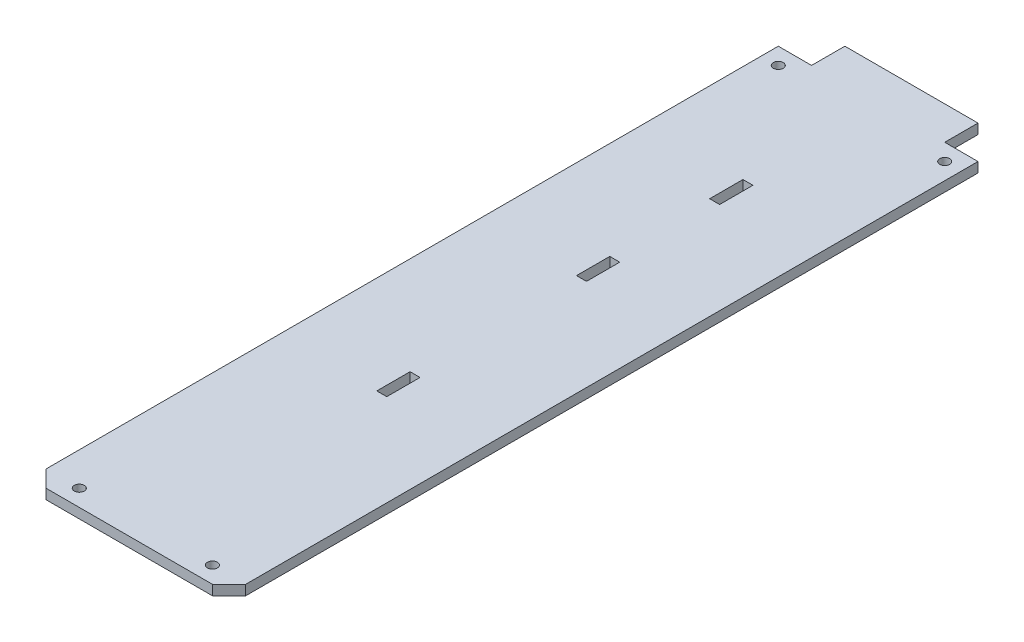
ISO-10303-21;
HEADER;
FILE_DESCRIPTION(('STEP AP214'),'2;1');
FILE_NAME('part.step','',(''),(''),'','','');
FILE_SCHEMA(('AUTOMOTIVE_DESIGN { 1 0 10303 214 1 1 1 1 }'));
ENDSEC;
DATA;
#1=APPLICATION_CONTEXT('core data for automotive mechanical design processes');
#2=APPLICATION_PROTOCOL_DEFINITION('international standard','automotive_design',2000,#1);
#3=PRODUCT_CONTEXT('',#1,'mechanical');
#4=PRODUCT('Part','Part','',(#3));
#5=PRODUCT_RELATED_PRODUCT_CATEGORY('part','',(#4));
#6=PRODUCT_DEFINITION_FORMATION('','',#4);
#7=PRODUCT_DEFINITION_CONTEXT('part definition',#1,'design');
#8=PRODUCT_DEFINITION('design','',#6,#7);
#9=PRODUCT_DEFINITION_SHAPE('','',#8);
#10=(LENGTH_UNIT() NAMED_UNIT(*) SI_UNIT(.MILLI.,.METRE.));
#11=(NAMED_UNIT(*) PLANE_ANGLE_UNIT() SI_UNIT($,.RADIAN.));
#12=(NAMED_UNIT(*) SI_UNIT($,.STERADIAN.) SOLID_ANGLE_UNIT());
#13=UNCERTAINTY_MEASURE_WITH_UNIT(LENGTH_MEASURE(1.E-05),#10,'distance_accuracy_value','');
#14=(GEOMETRIC_REPRESENTATION_CONTEXT(3) GLOBAL_UNCERTAINTY_ASSIGNED_CONTEXT((#13)) GLOBAL_UNIT_ASSIGNED_CONTEXT((#10,
#11,#12)) REPRESENTATION_CONTEXT('',''));
#15=CARTESIAN_POINT('',(0.,0.,0.));
#16=DIRECTION('',(0.,0.,1.));
#17=DIRECTION('',(1.,0.,0.));
#18=AXIS2_PLACEMENT_3D('',#15,#16,#17);
#19=CARTESIAN_POINT('',(29.1206219769056,3.,-112.5));
#20=DIRECTION('',(-1.,0.,0.));
#21=DIRECTION('',(0.,0.,1.));
#22=AXIS2_PLACEMENT_3D('',#19,#20,#21);
#23=PLANE('',#22);
#24=DIRECTION('',(0.,0.,-1.));
#25=VECTOR('',#24,1.);
#26=CARTESIAN_POINT('',(29.1206219769056,3.,-112.5));
#27=LINE('',#26,#25);
#28=CARTESIAN_POINT('',(29.1206219769056,3.,107.5));
#29=VERTEX_POINT('',#28);
#30=CARTESIAN_POINT('',(29.1206219769056,3.,-112.5));
#31=VERTEX_POINT('',#30);
#32=EDGE_CURVE('E271',#29,#31,#27,.T.);
#33=ORIENTED_EDGE('',*,*,#32,.F.);
#34=DIRECTION('',(0.,-1.,0.));
#35=VECTOR('',#34,1.);
#36=CARTESIAN_POINT('',(29.1206219769056,3.,107.5));
#37=LINE('',#36,#35);
#38=CARTESIAN_POINT('',(29.1206219769056,0.,107.5));
#39=VERTEX_POINT('',#38);
#40=EDGE_CURVE('E11',#29,#39,#37,.T.);
#41=ORIENTED_EDGE('',*,*,#40,.T.);
#42=DIRECTION('',(0.,0.,-1.));
#43=VECTOR('',#42,1.);
#44=CARTESIAN_POINT('',(29.1206219769056,0.,-112.5));
#45=LINE('',#44,#43);
#46=CARTESIAN_POINT('',(29.1206219769056,0.,-112.5));
#47=VERTEX_POINT('',#46);
#48=EDGE_CURVE('E289',#39,#47,#45,.T.);
#49=ORIENTED_EDGE('',*,*,#48,.T.);
#50=DIRECTION('',(0.,-1.,0.));
#51=VECTOR('',#50,1.);
#52=CARTESIAN_POINT('',(29.1206219769056,3.,-112.5));
#53=LINE('',#52,#51);
#54=EDGE_CURVE('E320',#31,#47,#53,.T.);
#55=ORIENTED_EDGE('',*,*,#54,.F.);
#56=EDGE_LOOP('',(#33,#41,#49,#55));
#57=FACE_BOUND('',#56,.T.);
#58=ADVANCED_FACE('F34',(#57),#23,.F.);
#59=CARTESIAN_POINT('',(19.1206219769056,3.,-112.5));
#60=DIRECTION('',(0.,0.,1.));
#61=DIRECTION('',(1.,0.,0.));
#62=AXIS2_PLACEMENT_3D('',#59,#60,#61);
#63=PLANE('',#62);
#64=DIRECTION('',(-1.,0.,0.));
#65=VECTOR('',#64,1.);
#66=CARTESIAN_POINT('',(19.1206219769056,0.,-112.5));
#67=LINE('',#66,#65);
#68=CARTESIAN_POINT('',(19.1206219769056,0.,-112.5));
#69=VERTEX_POINT('',#68);
#70=EDGE_CURVE('E291',#47,#69,#67,.T.);
#71=ORIENTED_EDGE('',*,*,#70,.T.);
#72=DIRECTION('',(0.,-1.,0.));
#73=VECTOR('',#72,1.);
#74=CARTESIAN_POINT('',(19.1206219769056,3.,-112.5));
#75=LINE('',#74,#73);
#76=CARTESIAN_POINT('',(19.1206219769056,3.,-112.5));
#77=VERTEX_POINT('',#76);
#78=EDGE_CURVE('E317',#77,#69,#75,.T.);
#79=ORIENTED_EDGE('',*,*,#78,.F.);
#80=DIRECTION('',(-1.,0.,0.));
#81=VECTOR('',#80,1.);
#82=CARTESIAN_POINT('',(19.1206219769056,3.,-112.5));
#83=LINE('',#82,#81);
#84=EDGE_CURVE('E273',#31,#77,#83,.T.);
#85=ORIENTED_EDGE('',*,*,#84,.F.);
#86=ORIENTED_EDGE('',*,*,#54,.T.);
#87=EDGE_LOOP('',(#71,#79,#85,#86));
#88=FACE_BOUND('',#87,.T.);
#89=ADVANCED_FACE('F416',(#88),#63,.F.);
#90=CARTESIAN_POINT('',(19.1206219769056,3.,-112.5));
#91=DIRECTION('',(-1.,0.,0.));
#92=DIRECTION('',(0.,0.,1.));
#93=AXIS2_PLACEMENT_3D('',#90,#91,#92);
#94=PLANE('',#93);
#95=DIRECTION('',(0.,0.,-1.));
#96=VECTOR('',#95,1.);
#97=CARTESIAN_POINT('',(19.1206219769056,0.,-112.5));
#98=LINE('',#97,#96);
#99=CARTESIAN_POINT('',(19.1206219769056,0.,-122.5));
#100=VERTEX_POINT('',#99);
#101=EDGE_CURVE('E294',#69,#100,#98,.T.);
#102=ORIENTED_EDGE('',*,*,#101,.T.);
#103=DIRECTION('',(0.,-1.,0.));
#104=VECTOR('',#103,1.);
#105=CARTESIAN_POINT('',(19.1206219769056,3.,-122.5));
#106=LINE('',#105,#104);
#107=CARTESIAN_POINT('',(19.1206219769056,3.,-122.5));
#108=VERTEX_POINT('',#107);
#109=EDGE_CURVE('E314',#108,#100,#106,.T.);
#110=ORIENTED_EDGE('',*,*,#109,.F.);
#111=DIRECTION('',(0.,0.,-1.));
#112=VECTOR('',#111,1.);
#113=CARTESIAN_POINT('',(19.1206219769056,3.,-112.5));
#114=LINE('',#113,#112);
#115=EDGE_CURVE('E276',#77,#108,#114,.T.);
#116=ORIENTED_EDGE('',*,*,#115,.F.);
#117=ORIENTED_EDGE('',*,*,#78,.T.);
#118=EDGE_LOOP('',(#102,#110,#116,#117));
#119=FACE_BOUND('',#118,.T.);
#120=ADVANCED_FACE('F409',(#119),#94,.F.);
#121=CARTESIAN_POINT('',(-20.8793780230944,3.,-122.5));
#122=DIRECTION('',(0.,0.,1.));
#123=DIRECTION('',(1.,0.,0.));
#124=AXIS2_PLACEMENT_3D('',#121,#122,#123);
#125=PLANE('',#124);
#126=DIRECTION('',(-1.,0.,0.));
#127=VECTOR('',#126,1.);
#128=CARTESIAN_POINT('',(-20.8793780230944,0.,-122.5));
#129=LINE('',#128,#127);
#130=CARTESIAN_POINT('',(-20.8793780230944,0.,-122.5));
#131=VERTEX_POINT('',#130);
#132=EDGE_CURVE('E296',#100,#131,#129,.T.);
#133=ORIENTED_EDGE('',*,*,#132,.T.);
#134=DIRECTION('',(0.,-1.,0.));
#135=VECTOR('',#134,1.);
#136=CARTESIAN_POINT('',(-20.8793780230944,3.,-122.5));
#137=LINE('',#136,#135);
#138=CARTESIAN_POINT('',(-20.8793780230944,3.,-122.5));
#139=VERTEX_POINT('',#138);
#140=EDGE_CURVE('E311',#139,#131,#137,.T.);
#141=ORIENTED_EDGE('',*,*,#140,.F.);
#142=DIRECTION('',(-1.,0.,0.));
#143=VECTOR('',#142,1.);
#144=CARTESIAN_POINT('',(-20.8793780230944,3.,-122.5));
#145=LINE('',#144,#143);
#146=EDGE_CURVE('E278',#108,#139,#145,.T.);
#147=ORIENTED_EDGE('',*,*,#146,.F.);
#148=ORIENTED_EDGE('',*,*,#109,.T.);
#149=EDGE_LOOP('',(#133,#141,#147,#148));
#150=FACE_BOUND('',#149,.T.);
#151=ADVANCED_FACE('F405',(#150),#125,.F.);
#152=CARTESIAN_POINT('',(-20.8793780230944,3.,-112.5));
#153=DIRECTION('',(1.,0.,0.));
#154=DIRECTION('',(0.,0.,-1.));
#155=AXIS2_PLACEMENT_3D('',#152,#153,#154);
#156=PLANE('',#155);
#157=DIRECTION('',(0.,0.,1.));
#158=VECTOR('',#157,1.);
#159=CARTESIAN_POINT('',(-20.8793780230944,0.,-112.5));
#160=LINE('',#159,#158);
#161=CARTESIAN_POINT('',(-20.8793780230944,0.,-112.5));
#162=VERTEX_POINT('',#161);
#163=EDGE_CURVE('E298',#131,#162,#160,.T.);
#164=ORIENTED_EDGE('',*,*,#163,.T.);
#165=DIRECTION('',(0.,-1.,0.));
#166=VECTOR('',#165,1.);
#167=CARTESIAN_POINT('',(-20.8793780230944,3.,-112.5));
#168=LINE('',#167,#166);
#169=CARTESIAN_POINT('',(-20.8793780230944,3.,-112.5));
#170=VERTEX_POINT('',#169);
#171=EDGE_CURVE('E308',#170,#162,#168,.T.);
#172=ORIENTED_EDGE('',*,*,#171,.F.);
#173=DIRECTION('',(0.,0.,1.));
#174=VECTOR('',#173,1.);
#175=CARTESIAN_POINT('',(-20.8793780230944,3.,-112.5));
#176=LINE('',#175,#174);
#177=EDGE_CURVE('E280',#139,#170,#176,.T.);
#178=ORIENTED_EDGE('',*,*,#177,.F.);
#179=ORIENTED_EDGE('',*,*,#140,.T.);
#180=EDGE_LOOP('',(#164,#172,#178,#179));
#181=FACE_BOUND('',#180,.T.);
#182=ADVANCED_FACE('F400',(#181),#156,.F.);
#183=CARTESIAN_POINT('',(-30.8793780230944,3.,-112.5));
#184=DIRECTION('',(0.,0.,1.));
#185=DIRECTION('',(1.,0.,0.));
#186=AXIS2_PLACEMENT_3D('',#183,#184,#185);
#187=PLANE('',#186);
#188=DIRECTION('',(-1.,0.,0.));
#189=VECTOR('',#188,1.);
#190=CARTESIAN_POINT('',(-30.8793780230944,0.,-112.5));
#191=LINE('',#190,#189);
#192=CARTESIAN_POINT('',(-30.8793780230944,0.,-112.5));
#193=VERTEX_POINT('',#192);
#194=EDGE_CURVE('E300',#162,#193,#191,.T.);
#195=ORIENTED_EDGE('',*,*,#194,.T.);
#196=DIRECTION('',(0.,-1.,0.));
#197=VECTOR('',#196,1.);
#198=CARTESIAN_POINT('',(-30.8793780230944,3.,-112.5));
#199=LINE('',#198,#197);
#200=CARTESIAN_POINT('',(-30.8793780230944,3.,-112.5));
#201=VERTEX_POINT('',#200);
#202=EDGE_CURVE('E288',#201,#193,#199,.T.);
#203=ORIENTED_EDGE('',*,*,#202,.F.);
#204=DIRECTION('',(-1.,0.,0.));
#205=VECTOR('',#204,1.);
#206=CARTESIAN_POINT('',(-30.8793780230944,3.,-112.5));
#207=LINE('',#206,#205);
#208=EDGE_CURVE('E282',#170,#201,#207,.T.);
#209=ORIENTED_EDGE('',*,*,#208,.F.);
#210=ORIENTED_EDGE('',*,*,#171,.T.);
#211=EDGE_LOOP('',(#195,#203,#209,#210));
#212=FACE_BOUND('',#211,.T.);
#213=ADVANCED_FACE('F394',(#212),#187,.F.);
#214=CARTESIAN_POINT('',(-30.8793780230944,3.,-112.5));
#215=DIRECTION('',(1.,0.,0.));
#216=DIRECTION('',(0.,0.,-1.));
#217=AXIS2_PLACEMENT_3D('',#214,#215,#216);
#218=PLANE('',#217);
#219=DIRECTION('',(0.,0.,1.));
#220=VECTOR('',#219,1.);
#221=CARTESIAN_POINT('',(-30.8793780230944,0.,-112.5));
#222=LINE('',#221,#220);
#223=CARTESIAN_POINT('',(-30.8793780230944,0.,107.5));
#224=VERTEX_POINT('',#223);
#225=EDGE_CURVE('E302',#193,#224,#222,.T.);
#226=ORIENTED_EDGE('',*,*,#225,.T.);
#227=DIRECTION('',(0.,1.,0.));
#228=VECTOR('',#227,1.);
#229=CARTESIAN_POINT('',(-30.8793780230944,3.,107.5));
#230=LINE('',#229,#228);
#231=CARTESIAN_POINT('',(-30.8793780230944,3.,107.5));
#232=VERTEX_POINT('',#231);
#233=EDGE_CURVE('E57',#224,#232,#230,.T.);
#234=ORIENTED_EDGE('',*,*,#233,.T.);
#235=DIRECTION('',(0.,0.,1.));
#236=VECTOR('',#235,1.);
#237=CARTESIAN_POINT('',(-30.8793780230944,3.,-112.5));
#238=LINE('',#237,#236);
#239=EDGE_CURVE('E284',#201,#232,#238,.T.);
#240=ORIENTED_EDGE('',*,*,#239,.F.);
#241=ORIENTED_EDGE('',*,*,#202,.T.);
#242=EDGE_LOOP('',(#226,#234,#240,#241));
#243=FACE_BOUND('',#242,.T.);
#244=ADVANCED_FACE('F390',(#243),#218,.F.);
#245=CARTESIAN_POINT('',(-30.8793780230944,3.,112.5));
#246=DIRECTION('',(0.,0.,-1.));
#247=DIRECTION('',(-1.,0.,0.));
#248=AXIS2_PLACEMENT_3D('',#245,#246,#247);
#249=PLANE('',#248);
#250=DIRECTION('',(1.,0.,0.));
#251=VECTOR('',#250,1.);
#252=CARTESIAN_POINT('',(-30.8793780230944,3.,112.5));
#253=LINE('',#252,#251);
#254=CARTESIAN_POINT('',(-25.8793780230944,3.,112.5));
#255=VERTEX_POINT('',#254);
#256=CARTESIAN_POINT('',(24.1206219769056,3.,112.5));
#257=VERTEX_POINT('',#256);
#258=EDGE_CURVE('E286',#255,#257,#253,.T.);
#259=ORIENTED_EDGE('',*,*,#258,.F.);
#260=DIRECTION('',(0.,-1.,0.));
#261=VECTOR('',#260,1.);
#262=CARTESIAN_POINT('',(-25.8793780230944,3.,112.5));
#263=LINE('',#262,#261);
#264=CARTESIAN_POINT('',(-25.8793780230944,0.,112.5));
#265=VERTEX_POINT('',#264);
#266=EDGE_CURVE('E369',#255,#265,#263,.T.);
#267=ORIENTED_EDGE('',*,*,#266,.T.);
#268=DIRECTION('',(1.,0.,0.));
#269=VECTOR('',#268,1.);
#270=CARTESIAN_POINT('',(-30.8793780230944,0.,112.5));
#271=LINE('',#270,#269);
#272=CARTESIAN_POINT('',(24.1206219769056,0.,112.5));
#273=VERTEX_POINT('',#272);
#274=EDGE_CURVE('E274',#265,#273,#271,.T.);
#275=ORIENTED_EDGE('',*,*,#274,.T.);
#276=DIRECTION('',(0.,1.,0.));
#277=VECTOR('',#276,1.);
#278=CARTESIAN_POINT('',(24.1206219769056,3.,112.5));
#279=LINE('',#278,#277);
#280=EDGE_CURVE('E365',#273,#257,#279,.T.);
#281=ORIENTED_EDGE('',*,*,#280,.T.);
#282=EDGE_LOOP('',(#259,#267,#275,#281));
#283=FACE_BOUND('',#282,.T.);
#284=ADVANCED_FACE('F382',(#283),#249,.F.);
#285=CARTESIAN_POINT('',(0.,3.,0.));
#286=DIRECTION('',(0.,1.,0.));
#287=DIRECTION('',(0.,0.,1.));
#288=AXIS2_PLACEMENT_3D('',#285,#286,#287);
#289=PLANE('',#288);
#290=CARTESIAN_POINT('',(24.1206219769056,3.,-107.5));
#291=DIRECTION('',(0.,1.,0.));
#292=DIRECTION('',(0.,0.,1.));
#293=AXIS2_PLACEMENT_3D('',#290,#291,#292);
#294=CIRCLE('',#293,1.5);
#295=CARTESIAN_POINT('',(24.1206219769056,3.,-106.));
#296=VERTEX_POINT('',#295);
#297=EDGE_CURVE('E268',#296,#296,#294,.T.);
#298=ORIENTED_EDGE('',*,*,#297,.F.);
#299=EDGE_LOOP('',(#298));
#300=FACE_BOUND('',#299,.T.);
#301=DIRECTION('',(0.,0.,-1.));
#302=VECTOR('',#301,1.);
#303=CARTESIAN_POINT('',(1.5,3.,-32.5));
#304=LINE('',#303,#302);
#305=CARTESIAN_POINT('',(1.5,3.,-22.5));
#306=VERTEX_POINT('',#305);
#307=CARTESIAN_POINT('',(1.5,3.,-32.5));
#308=VERTEX_POINT('',#307);
#309=EDGE_CURVE('E222',#306,#308,#304,.T.);
#310=ORIENTED_EDGE('',*,*,#309,.F.);
#311=DIRECTION('',(1.,0.,0.));
#312=VECTOR('',#311,1.);
#313=CARTESIAN_POINT('',(-1.5,3.,-22.5));
#314=LINE('',#313,#312);
#315=CARTESIAN_POINT('',(-1.5,3.,-22.5));
#316=VERTEX_POINT('',#315);
#317=EDGE_CURVE('E230',#316,#306,#314,.T.);
#318=ORIENTED_EDGE('',*,*,#317,.F.);
#319=DIRECTION('',(0.,0.,1.));
#320=VECTOR('',#319,1.);
#321=CARTESIAN_POINT('',(-1.5,3.,-32.5));
#322=LINE('',#321,#320);
#323=CARTESIAN_POINT('',(-1.5,3.,-32.5));
#324=VERTEX_POINT('',#323);
#325=EDGE_CURVE('E227',#324,#316,#322,.T.);
#326=ORIENTED_EDGE('',*,*,#325,.F.);
#327=DIRECTION('',(-1.,0.,0.));
#328=VECTOR('',#327,1.);
#329=CARTESIAN_POINT('',(-1.5,3.,-32.5));
#330=LINE('',#329,#328);
#331=EDGE_CURVE('E224',#308,#324,#330,.T.);
#332=ORIENTED_EDGE('',*,*,#331,.F.);
#333=EDGE_LOOP('',(#310,#318,#326,#332));
#334=FACE_BOUND('',#333,.T.);
#335=DIRECTION('',(0.,0.,-1.));
#336=VECTOR('',#335,1.);
#337=CARTESIAN_POINT('',(1.5,3.,27.5));
#338=LINE('',#337,#336);
#339=CARTESIAN_POINT('',(1.5,3.,37.5));
#340=VERTEX_POINT('',#339);
#341=CARTESIAN_POINT('',(1.5,3.,27.5));
#342=VERTEX_POINT('',#341);
#343=EDGE_CURVE('E207',#340,#342,#338,.T.);
#344=ORIENTED_EDGE('',*,*,#343,.F.);
#345=DIRECTION('',(1.,0.,0.));
#346=VECTOR('',#345,1.);
#347=CARTESIAN_POINT('',(-1.5,3.,37.5));
#348=LINE('',#347,#346);
#349=CARTESIAN_POINT('',(-1.5,3.,37.5));
#350=VERTEX_POINT('',#349);
#351=EDGE_CURVE('E212',#350,#340,#348,.T.);
#352=ORIENTED_EDGE('',*,*,#351,.F.);
#353=DIRECTION('',(0.,0.,1.));
#354=VECTOR('',#353,1.);
#355=CARTESIAN_POINT('',(-1.5,3.,27.5));
#356=LINE('',#355,#354);
#357=CARTESIAN_POINT('',(-1.5,3.,27.5));
#358=VERTEX_POINT('',#357);
#359=EDGE_CURVE('E191',#358,#350,#356,.T.);
#360=ORIENTED_EDGE('',*,*,#359,.F.);
#361=DIRECTION('',(-1.,0.,0.));
#362=VECTOR('',#361,1.);
#363=CARTESIAN_POINT('',(-1.5,3.,27.5));
#364=LINE('',#363,#362);
#365=EDGE_CURVE('E202',#342,#358,#364,.T.);
#366=ORIENTED_EDGE('',*,*,#365,.F.);
#367=EDGE_LOOP('',(#344,#352,#360,#366));
#368=FACE_BOUND('',#367,.T.);
#369=CARTESIAN_POINT('',(-25.8793780230944,3.,-107.5));
#370=DIRECTION('',(0.,1.,0.));
#371=DIRECTION('',(0.,0.,1.));
#372=AXIS2_PLACEMENT_3D('',#369,#370,#371);
#373=CIRCLE('',#372,1.5);
#374=CARTESIAN_POINT('',(-25.8793780230944,3.,-106.));
#375=VERTEX_POINT('',#374);
#376=EDGE_CURVE('E265',#375,#375,#373,.T.);
#377=ORIENTED_EDGE('',*,*,#376,.F.);
#378=EDGE_LOOP('',(#377));
#379=FACE_BOUND('',#378,.T.);
#380=CARTESIAN_POINT('',(19.1206219769056,3.,107.5));
#381=DIRECTION('',(0.,1.,0.));
#382=DIRECTION('',(0.,0.,1.));
#383=AXIS2_PLACEMENT_3D('',#380,#381,#382);
#384=CIRCLE('',#383,1.5);
#385=CARTESIAN_POINT('',(19.1206219769056,3.,109.));
#386=VERTEX_POINT('',#385);
#387=EDGE_CURVE('E245',#386,#386,#384,.T.);
#388=ORIENTED_EDGE('',*,*,#387,.F.);
#389=EDGE_LOOP('',(#388));
#390=FACE_BOUND('',#389,.T.);
#391=CARTESIAN_POINT('',(-20.8793780230944,3.,107.5));
#392=DIRECTION('',(0.,1.,0.));
#393=DIRECTION('',(0.,0.,1.));
#394=AXIS2_PLACEMENT_3D('',#391,#392,#393);
#395=CIRCLE('',#394,1.5);
#396=CARTESIAN_POINT('',(-20.8793780230944,3.,109.));
#397=VERTEX_POINT('',#396);
#398=EDGE_CURVE('E242',#397,#397,#395,.T.);
#399=ORIENTED_EDGE('',*,*,#398,.F.);
#400=EDGE_LOOP('',(#399));
#401=FACE_BOUND('',#400,.T.);
#402=DIRECTION('',(0.,0.,-1.));
#403=VECTOR('',#402,1.);
#404=CARTESIAN_POINT('',(1.5,3.,-72.5));
#405=LINE('',#404,#403);
#406=CARTESIAN_POINT('',(1.5,3.,-62.5));
#407=VERTEX_POINT('',#406);
#408=CARTESIAN_POINT('',(1.5,3.,-72.5));
#409=VERTEX_POINT('',#408);
#410=EDGE_CURVE('E219',#407,#409,#405,.T.);
#411=ORIENTED_EDGE('',*,*,#410,.F.);
#412=DIRECTION('',(1.,0.,0.));
#413=VECTOR('',#412,1.);
#414=CARTESIAN_POINT('',(-1.5,3.,-62.5));
#415=LINE('',#414,#413);
#416=CARTESIAN_POINT('',(-1.5,3.,-62.5));
#417=VERTEX_POINT('',#416);
#418=EDGE_CURVE('E254',#417,#407,#415,.T.);
#419=ORIENTED_EDGE('',*,*,#418,.F.);
#420=DIRECTION('',(0.,0.,1.));
#421=VECTOR('',#420,1.);
#422=CARTESIAN_POINT('',(-1.5,3.,-72.5));
#423=LINE('',#422,#421);
#424=CARTESIAN_POINT('',(-1.5,3.,-72.5));
#425=VERTEX_POINT('',#424);
#426=EDGE_CURVE('E251',#425,#417,#423,.T.);
#427=ORIENTED_EDGE('',*,*,#426,.F.);
#428=DIRECTION('',(-1.,0.,0.));
#429=VECTOR('',#428,1.);
#430=CARTESIAN_POINT('',(-1.5,3.,-72.5));
#431=LINE('',#430,#429);
#432=EDGE_CURVE('E248',#409,#425,#431,.T.);
#433=ORIENTED_EDGE('',*,*,#432,.F.);
#434=EDGE_LOOP('',(#411,#419,#427,#433));
#435=FACE_BOUND('',#434,.T.);
#436=ORIENTED_EDGE('',*,*,#239,.T.);
#437=DIRECTION('',(-0.707106781186545,0.,-0.70710678118655));
#438=VECTOR('',#437,1.);
#439=CARTESIAN_POINT('',(-69.1896890115473,3.,69.1896890115467));
#440=LINE('',#439,#438);
#441=EDGE_CURVE('E42',#232,#255,#440,.F.);
#442=ORIENTED_EDGE('',*,*,#441,.T.);
#443=ORIENTED_EDGE('',*,*,#258,.T.);
#444=DIRECTION('',(-0.707106781186549,0.,0.707106781186546));
#445=VECTOR('',#444,1.);
#446=CARTESIAN_POINT('',(68.3103109884527,3.,68.3103109884531));
#447=LINE('',#446,#445);
#448=EDGE_CURVE('E49',#257,#29,#447,.F.);
#449=ORIENTED_EDGE('',*,*,#448,.T.);
#450=ORIENTED_EDGE('',*,*,#32,.T.);
#451=ORIENTED_EDGE('',*,*,#84,.T.);
#452=ORIENTED_EDGE('',*,*,#115,.T.);
#453=ORIENTED_EDGE('',*,*,#146,.T.);
#454=ORIENTED_EDGE('',*,*,#177,.T.);
#455=ORIENTED_EDGE('',*,*,#208,.T.);
#456=EDGE_LOOP('',(#436,#442,#443,#449,#450,#451,#452,#453,#454,#455));
#457=FACE_BOUND('',#456,.T.);
#458=ADVANCED_FACE('F209',(#300,#334,#368,#379,#390,#401,#435,#457),#289,.T.);
#459=CARTESIAN_POINT('',(0.,0.,0.));
#460=DIRECTION('',(0.,1.,0.));
#461=DIRECTION('',(0.,0.,1.));
#462=AXIS2_PLACEMENT_3D('',#459,#460,#461);
#463=PLANE('',#462);
#464=CARTESIAN_POINT('',(24.1206219769056,0.,-107.5));
#465=DIRECTION('',(0.,1.,0.));
#466=DIRECTION('',(0.,0.,1.));
#467=AXIS2_PLACEMENT_3D('',#464,#465,#466);
#468=CIRCLE('',#467,1.5);
#469=CARTESIAN_POINT('',(24.1206219769056,0.,-106.));
#470=VERTEX_POINT('',#469);
#471=EDGE_CURVE('E292',#470,#470,#468,.T.);
#472=ORIENTED_EDGE('',*,*,#471,.T.);
#473=EDGE_LOOP('',(#472));
#474=FACE_BOUND('',#473,.T.);
#475=DIRECTION('',(1.,0.,0.));
#476=VECTOR('',#475,1.);
#477=CARTESIAN_POINT('',(0.,0.,-22.5));
#478=LINE('',#477,#476);
#479=CARTESIAN_POINT('',(-1.5,0.,-22.5));
#480=VERTEX_POINT('',#479);
#481=CARTESIAN_POINT('',(1.5,0.,-22.5));
#482=VERTEX_POINT('',#481);
#483=EDGE_CURVE('E359',#480,#482,#478,.T.);
#484=ORIENTED_EDGE('',*,*,#483,.T.);
#485=DIRECTION('',(0.,0.,-1.));
#486=VECTOR('',#485,1.);
#487=CARTESIAN_POINT('',(1.5,0.,0.));
#488=LINE('',#487,#486);
#489=CARTESIAN_POINT('',(1.5,0.,-32.5));
#490=VERTEX_POINT('',#489);
#491=EDGE_CURVE('E362',#482,#490,#488,.T.);
#492=ORIENTED_EDGE('',*,*,#491,.T.);
#493=DIRECTION('',(-1.,0.,0.));
#494=VECTOR('',#493,1.);
#495=CARTESIAN_POINT('',(0.,0.,-32.5));
#496=LINE('',#495,#494);
#497=CARTESIAN_POINT('',(-1.5,0.,-32.5));
#498=VERTEX_POINT('',#497);
#499=EDGE_CURVE('E353',#490,#498,#496,.T.);
#500=ORIENTED_EDGE('',*,*,#499,.T.);
#501=DIRECTION('',(0.,0.,1.));
#502=VECTOR('',#501,1.);
#503=CARTESIAN_POINT('',(-1.5,0.,0.));
#504=LINE('',#503,#502);
#505=EDGE_CURVE('E356',#498,#480,#504,.T.);
#506=ORIENTED_EDGE('',*,*,#505,.T.);
#507=EDGE_LOOP('',(#484,#492,#500,#506));
#508=FACE_BOUND('',#507,.T.);
#509=DIRECTION('',(1.,0.,0.));
#510=VECTOR('',#509,1.);
#511=CARTESIAN_POINT('',(0.,0.,37.5));
#512=LINE('',#511,#510);
#513=CARTESIAN_POINT('',(-1.5,0.,37.5));
#514=VERTEX_POINT('',#513);
#515=CARTESIAN_POINT('',(1.5,0.,37.5));
#516=VERTEX_POINT('',#515);
#517=EDGE_CURVE('E347',#514,#516,#512,.T.);
#518=ORIENTED_EDGE('',*,*,#517,.T.);
#519=DIRECTION('',(0.,0.,-1.));
#520=VECTOR('',#519,1.);
#521=CARTESIAN_POINT('',(1.5,0.,0.));
#522=LINE('',#521,#520);
#523=CARTESIAN_POINT('',(1.5,0.,27.5));
#524=VERTEX_POINT('',#523);
#525=EDGE_CURVE('E350',#516,#524,#522,.T.);
#526=ORIENTED_EDGE('',*,*,#525,.T.);
#527=DIRECTION('',(-1.,0.,0.));
#528=VECTOR('',#527,1.);
#529=CARTESIAN_POINT('',(0.,0.,27.5));
#530=LINE('',#529,#528);
#531=CARTESIAN_POINT('',(-1.5,0.,27.5));
#532=VERTEX_POINT('',#531);
#533=EDGE_CURVE('E335',#524,#532,#530,.T.);
#534=ORIENTED_EDGE('',*,*,#533,.T.);
#535=DIRECTION('',(0.,0.,1.));
#536=VECTOR('',#535,1.);
#537=CARTESIAN_POINT('',(-1.5,0.,0.));
#538=LINE('',#537,#536);
#539=EDGE_CURVE('E194',#532,#514,#538,.T.);
#540=ORIENTED_EDGE('',*,*,#539,.T.);
#541=EDGE_LOOP('',(#518,#526,#534,#540));
#542=FACE_BOUND('',#541,.T.);
#543=CARTESIAN_POINT('',(-25.8793780230944,0.,-107.5));
#544=DIRECTION('',(0.,1.,0.));
#545=DIRECTION('',(0.,0.,1.));
#546=AXIS2_PLACEMENT_3D('',#543,#544,#545);
#547=CIRCLE('',#546,1.5);
#548=CARTESIAN_POINT('',(-25.8793780230944,0.,-106.));
#549=VERTEX_POINT('',#548);
#550=EDGE_CURVE('E342',#549,#549,#547,.T.);
#551=ORIENTED_EDGE('',*,*,#550,.T.);
#552=EDGE_LOOP('',(#551));
#553=FACE_BOUND('',#552,.T.);
#554=CARTESIAN_POINT('',(19.1206219769056,0.,107.5));
#555=DIRECTION('',(0.,1.,0.));
#556=DIRECTION('',(0.,0.,1.));
#557=AXIS2_PLACEMENT_3D('',#554,#555,#556);
#558=CIRCLE('',#557,1.5);
#559=CARTESIAN_POINT('',(19.1206219769056,0.,109.));
#560=VERTEX_POINT('',#559);
#561=EDGE_CURVE('E339',#560,#560,#558,.T.);
#562=ORIENTED_EDGE('',*,*,#561,.T.);
#563=EDGE_LOOP('',(#562));
#564=FACE_BOUND('',#563,.T.);
#565=CARTESIAN_POINT('',(-20.8793780230944,0.,107.5));
#566=DIRECTION('',(0.,1.,0.));
#567=DIRECTION('',(0.,0.,1.));
#568=AXIS2_PLACEMENT_3D('',#565,#566,#567);
#569=CIRCLE('',#568,1.5);
#570=CARTESIAN_POINT('',(-20.8793780230944,0.,109.));
#571=VERTEX_POINT('',#570);
#572=EDGE_CURVE('E336',#571,#571,#569,.T.);
#573=ORIENTED_EDGE('',*,*,#572,.T.);
#574=EDGE_LOOP('',(#573));
#575=FACE_BOUND('',#574,.T.);
#576=DIRECTION('',(1.,0.,0.));
#577=VECTOR('',#576,1.);
#578=CARTESIAN_POINT('',(0.,0.,-62.5));
#579=LINE('',#578,#577);
#580=CARTESIAN_POINT('',(-1.5,0.,-62.5));
#581=VERTEX_POINT('',#580);
#582=CARTESIAN_POINT('',(1.5,0.,-62.5));
#583=VERTEX_POINT('',#582);
#584=EDGE_CURVE('E329',#581,#583,#579,.T.);
#585=ORIENTED_EDGE('',*,*,#584,.T.);
#586=DIRECTION('',(0.,0.,-1.));
#587=VECTOR('',#586,1.);
#588=CARTESIAN_POINT('',(1.50000000000001,0.,0.));
#589=LINE('',#588,#587);
#590=CARTESIAN_POINT('',(1.5,0.,-72.5));
#591=VERTEX_POINT('',#590);
#592=EDGE_CURVE('E332',#583,#591,#589,.T.);
#593=ORIENTED_EDGE('',*,*,#592,.T.);
#594=DIRECTION('',(-1.,0.,0.));
#595=VECTOR('',#594,1.);
#596=CARTESIAN_POINT('',(3.35379872022183E-13,0.,-72.5));
#597=LINE('',#596,#595);
#598=CARTESIAN_POINT('',(-1.5,0.,-72.5));
#599=VERTEX_POINT('',#598);
#600=EDGE_CURVE('E323',#591,#599,#597,.T.);
#601=ORIENTED_EDGE('',*,*,#600,.T.);
#602=DIRECTION('',(0.,0.,1.));
#603=VECTOR('',#602,1.);
#604=CARTESIAN_POINT('',(-1.49999999999999,0.,0.));
#605=LINE('',#604,#603);
#606=EDGE_CURVE('E326',#599,#581,#605,.T.);
#607=ORIENTED_EDGE('',*,*,#606,.T.);
#608=EDGE_LOOP('',(#585,#593,#601,#607));
#609=FACE_BOUND('',#608,.T.);
#610=ORIENTED_EDGE('',*,*,#274,.F.);
#611=DIRECTION('',(0.707106781186545,0.,0.70710678118655));
#612=VECTOR('',#611,1.);
#613=CARTESIAN_POINT('',(-25.8793780230944,0.,112.5));
#614=LINE('',#613,#612);
#615=EDGE_CURVE('E374',#265,#224,#614,.F.);
#616=ORIENTED_EDGE('',*,*,#615,.T.);
#617=ORIENTED_EDGE('',*,*,#225,.F.);
#618=ORIENTED_EDGE('',*,*,#194,.F.);
#619=ORIENTED_EDGE('',*,*,#163,.F.);
#620=ORIENTED_EDGE('',*,*,#132,.F.);
#621=ORIENTED_EDGE('',*,*,#101,.F.);
#622=ORIENTED_EDGE('',*,*,#70,.F.);
#623=ORIENTED_EDGE('',*,*,#48,.F.);
#624=DIRECTION('',(0.707106781186549,0.,-0.707106781186546));
#625=VECTOR('',#624,1.);
#626=CARTESIAN_POINT('',(29.1206219769056,0.,107.5));
#627=LINE('',#626,#625);
#628=EDGE_CURVE('E372',#39,#273,#627,.F.);
#629=ORIENTED_EDGE('',*,*,#628,.T.);
#630=EDGE_LOOP('',(#610,#616,#617,#618,#619,#620,#621,#622,#623,#629));
#631=FACE_BOUND('',#630,.T.);
#632=ADVANCED_FACE('F388',(#474,#508,#542,#553,#564,#575,#609,#631),#463,.F.);
#633=CARTESIAN_POINT('',(1.5,-22.,-72.5));
#634=DIRECTION('',(1.,0.,0.));
#635=DIRECTION('',(0.,0.,-1.));
#636=AXIS2_PLACEMENT_3D('',#633,#634,#635);
#637=PLANE('',#636);
#638=DIRECTION('',(0.,1.,0.));
#639=VECTOR('',#638,1.);
#640=CARTESIAN_POINT('',(1.5,-22.,-62.5));
#641=LINE('',#640,#639);
#642=EDGE_CURVE('E246',#583,#407,#641,.T.);
#643=ORIENTED_EDGE('',*,*,#642,.T.);
#644=ORIENTED_EDGE('',*,*,#410,.T.);
#645=DIRECTION('',(0.,1.,0.));
#646=VECTOR('',#645,1.);
#647=CARTESIAN_POINT('',(1.5,-22.,-72.5));
#648=LINE('',#647,#646);
#649=EDGE_CURVE('E257',#591,#409,#648,.T.);
#650=ORIENTED_EDGE('',*,*,#649,.F.);
#651=ORIENTED_EDGE('',*,*,#592,.F.);
#652=EDGE_LOOP('',(#643,#644,#650,#651));
#653=FACE_BOUND('',#652,.T.);
#654=ADVANCED_FACE('F446',(#653),#637,.F.);
#655=CARTESIAN_POINT('',(-1.5,-22.,-62.5));
#656=DIRECTION('',(0.,0.,1.));
#657=DIRECTION('',(1.,0.,0.));
#658=AXIS2_PLACEMENT_3D('',#655,#656,#657);
#659=PLANE('',#658);
#660=DIRECTION('',(0.,1.,0.));
#661=VECTOR('',#660,1.);
#662=CARTESIAN_POINT('',(-1.5,-22.,-62.5));
#663=LINE('',#662,#661);
#664=EDGE_CURVE('E259',#581,#417,#663,.T.);
#665=ORIENTED_EDGE('',*,*,#664,.T.);
#666=ORIENTED_EDGE('',*,*,#418,.T.);
#667=ORIENTED_EDGE('',*,*,#642,.F.);
#668=ORIENTED_EDGE('',*,*,#584,.F.);
#669=EDGE_LOOP('',(#665,#666,#667,#668));
#670=FACE_BOUND('',#669,.T.);
#671=ADVANCED_FACE('F463',(#670),#659,.F.);
#672=CARTESIAN_POINT('',(-1.5,-22.,-72.5));
#673=DIRECTION('',(-1.,0.,0.));
#674=DIRECTION('',(0.,0.,1.));
#675=AXIS2_PLACEMENT_3D('',#672,#673,#674);
#676=PLANE('',#675);
#677=DIRECTION('',(0.,1.,0.));
#678=VECTOR('',#677,1.);
#679=CARTESIAN_POINT('',(-1.5,-22.,-72.5));
#680=LINE('',#679,#678);
#681=EDGE_CURVE('E261',#599,#425,#680,.T.);
#682=ORIENTED_EDGE('',*,*,#681,.T.);
#683=ORIENTED_EDGE('',*,*,#426,.T.);
#684=ORIENTED_EDGE('',*,*,#664,.F.);
#685=ORIENTED_EDGE('',*,*,#606,.F.);
#686=EDGE_LOOP('',(#682,#683,#684,#685));
#687=FACE_BOUND('',#686,.T.);
#688=ADVANCED_FACE('F468',(#687),#676,.F.);
#689=CARTESIAN_POINT('',(-1.5,-22.,-72.5));
#690=DIRECTION('',(0.,0.,-1.));
#691=DIRECTION('',(-1.,0.,0.));
#692=AXIS2_PLACEMENT_3D('',#689,#690,#691);
#693=PLANE('',#692);
#694=ORIENTED_EDGE('',*,*,#649,.T.);
#695=ORIENTED_EDGE('',*,*,#432,.T.);
#696=ORIENTED_EDGE('',*,*,#681,.F.);
#697=ORIENTED_EDGE('',*,*,#600,.F.);
#698=EDGE_LOOP('',(#694,#695,#696,#697));
#699=FACE_BOUND('',#698,.T.);
#700=ADVANCED_FACE('F465',(#699),#693,.F.);
#701=CARTESIAN_POINT('',(-20.8793780230944,-22.,107.5));
#702=DIRECTION('',(0.,1.,0.));
#703=DIRECTION('',(0.,0.,1.));
#704=AXIS2_PLACEMENT_3D('',#701,#702,#703);
#705=CYLINDRICAL_SURFACE('',#704,1.5);
#706=ORIENTED_EDGE('',*,*,#398,.T.);
#707=EDGE_LOOP('',(#706));
#708=FACE_BOUND('',#707,.T.);
#709=ORIENTED_EDGE('',*,*,#572,.F.);
#710=EDGE_LOOP('',(#709));
#711=FACE_BOUND('',#710,.T.);
#712=ADVANCED_FACE('F455',(#708,#711),#705,.F.);
#713=CARTESIAN_POINT('',(19.1206219769056,-22.,107.5));
#714=DIRECTION('',(0.,1.,0.));
#715=DIRECTION('',(0.,0.,1.));
#716=AXIS2_PLACEMENT_3D('',#713,#714,#715);
#717=CYLINDRICAL_SURFACE('',#716,1.5);
#718=ORIENTED_EDGE('',*,*,#387,.T.);
#719=EDGE_LOOP('',(#718));
#720=FACE_BOUND('',#719,.T.);
#721=ORIENTED_EDGE('',*,*,#561,.F.);
#722=EDGE_LOOP('',(#721));
#723=FACE_BOUND('',#722,.T.);
#724=ADVANCED_FACE('F451',(#720,#723),#717,.F.);
#725=CARTESIAN_POINT('',(-25.8793780230944,-22.,-107.5));
#726=DIRECTION('',(0.,1.,0.));
#727=DIRECTION('',(0.,0.,1.));
#728=AXIS2_PLACEMENT_3D('',#725,#726,#727);
#729=CYLINDRICAL_SURFACE('',#728,1.5);
#730=ORIENTED_EDGE('',*,*,#376,.T.);
#731=EDGE_LOOP('',(#730));
#732=FACE_BOUND('',#731,.T.);
#733=ORIENTED_EDGE('',*,*,#550,.F.);
#734=EDGE_LOOP('',(#733));
#735=FACE_BOUND('',#734,.T.);
#736=ADVANCED_FACE('F454',(#732,#735),#729,.F.);
#737=CARTESIAN_POINT('',(1.5,-22.,27.5));
#738=DIRECTION('',(1.,0.,0.));
#739=DIRECTION('',(0.,0.,-1.));
#740=AXIS2_PLACEMENT_3D('',#737,#738,#739);
#741=PLANE('',#740);
#742=DIRECTION('',(0.,1.,0.));
#743=VECTOR('',#742,1.);
#744=CARTESIAN_POINT('',(1.5,-22.,37.5));
#745=LINE('',#744,#743);
#746=EDGE_CURVE('E217',#516,#340,#745,.T.);
#747=ORIENTED_EDGE('',*,*,#746,.T.);
#748=ORIENTED_EDGE('',*,*,#343,.T.);
#749=DIRECTION('',(0.,1.,0.));
#750=VECTOR('',#749,1.);
#751=CARTESIAN_POINT('',(1.5,-22.,27.5));
#752=LINE('',#751,#750);
#753=EDGE_CURVE('E198',#524,#342,#752,.T.);
#754=ORIENTED_EDGE('',*,*,#753,.F.);
#755=ORIENTED_EDGE('',*,*,#525,.F.);
#756=EDGE_LOOP('',(#747,#748,#754,#755));
#757=FACE_BOUND('',#756,.T.);
#758=ADVANCED_FACE('F459',(#757),#741,.F.);
#759=CARTESIAN_POINT('',(-1.5,-22.,37.5));
#760=DIRECTION('',(0.,0.,1.));
#761=DIRECTION('',(1.,0.,0.));
#762=AXIS2_PLACEMENT_3D('',#759,#760,#761);
#763=PLANE('',#762);
#764=DIRECTION('',(0.,1.,0.));
#765=VECTOR('',#764,1.);
#766=CARTESIAN_POINT('',(-1.5,-22.,37.5));
#767=LINE('',#766,#765);
#768=EDGE_CURVE('E197',#514,#350,#767,.T.);
#769=ORIENTED_EDGE('',*,*,#768,.T.);
#770=ORIENTED_EDGE('',*,*,#351,.T.);
#771=ORIENTED_EDGE('',*,*,#746,.F.);
#772=ORIENTED_EDGE('',*,*,#517,.F.);
#773=EDGE_LOOP('',(#769,#770,#771,#772));
#774=FACE_BOUND('',#773,.T.);
#775=ADVANCED_FACE('F497',(#774),#763,.F.);
#776=CARTESIAN_POINT('',(-1.5,-22.,27.5));
#777=DIRECTION('',(-1.,0.,0.));
#778=DIRECTION('',(0.,0.,1.));
#779=AXIS2_PLACEMENT_3D('',#776,#777,#778);
#780=PLANE('',#779);
#781=DIRECTION('',(0.,1.,0.));
#782=VECTOR('',#781,1.);
#783=CARTESIAN_POINT('',(-1.5,-22.,27.5));
#784=LINE('',#783,#782);
#785=EDGE_CURVE('E186',#532,#358,#784,.T.);
#786=ORIENTED_EDGE('',*,*,#785,.T.);
#787=ORIENTED_EDGE('',*,*,#359,.T.);
#788=ORIENTED_EDGE('',*,*,#768,.F.);
#789=ORIENTED_EDGE('',*,*,#539,.F.);
#790=EDGE_LOOP('',(#786,#787,#788,#789));
#791=FACE_BOUND('',#790,.T.);
#792=ADVANCED_FACE('F188',(#791),#780,.F.);
#793=CARTESIAN_POINT('',(-1.5,-22.,27.5));
#794=DIRECTION('',(0.,0.,-1.));
#795=DIRECTION('',(-1.,0.,0.));
#796=AXIS2_PLACEMENT_3D('',#793,#794,#795);
#797=PLANE('',#796);
#798=ORIENTED_EDGE('',*,*,#753,.T.);
#799=ORIENTED_EDGE('',*,*,#365,.T.);
#800=ORIENTED_EDGE('',*,*,#785,.F.);
#801=ORIENTED_EDGE('',*,*,#533,.F.);
#802=EDGE_LOOP('',(#798,#799,#800,#801));
#803=FACE_BOUND('',#802,.T.);
#804=ADVANCED_FACE('F203',(#803),#797,.F.);
#805=CARTESIAN_POINT('',(1.5,-22.,-32.5));
#806=DIRECTION('',(1.,0.,0.));
#807=DIRECTION('',(0.,0.,-1.));
#808=AXIS2_PLACEMENT_3D('',#805,#806,#807);
#809=PLANE('',#808);
#810=DIRECTION('',(0.,1.,0.));
#811=VECTOR('',#810,1.);
#812=CARTESIAN_POINT('',(1.5,-22.,-22.5));
#813=LINE('',#812,#811);
#814=EDGE_CURVE('E234',#482,#306,#813,.T.);
#815=ORIENTED_EDGE('',*,*,#814,.T.);
#816=ORIENTED_EDGE('',*,*,#309,.T.);
#817=DIRECTION('',(0.,1.,0.));
#818=VECTOR('',#817,1.);
#819=CARTESIAN_POINT('',(1.5,-22.,-32.5));
#820=LINE('',#819,#818);
#821=EDGE_CURVE('E233',#490,#308,#820,.T.);
#822=ORIENTED_EDGE('',*,*,#821,.F.);
#823=ORIENTED_EDGE('',*,*,#491,.F.);
#824=EDGE_LOOP('',(#815,#816,#822,#823));
#825=FACE_BOUND('',#824,.T.);
#826=ADVANCED_FACE('F479',(#825),#809,.F.);
#827=CARTESIAN_POINT('',(-1.5,-22.,-22.5));
#828=DIRECTION('',(0.,0.,1.));
#829=DIRECTION('',(1.,0.,0.));
#830=AXIS2_PLACEMENT_3D('',#827,#828,#829);
#831=PLANE('',#830);
#832=DIRECTION('',(0.,1.,0.));
#833=VECTOR('',#832,1.);
#834=CARTESIAN_POINT('',(-1.5,-22.,-22.5));
#835=LINE('',#834,#833);
#836=EDGE_CURVE('E236',#480,#316,#835,.T.);
#837=ORIENTED_EDGE('',*,*,#836,.T.);
#838=ORIENTED_EDGE('',*,*,#317,.T.);
#839=ORIENTED_EDGE('',*,*,#814,.F.);
#840=ORIENTED_EDGE('',*,*,#483,.F.);
#841=EDGE_LOOP('',(#837,#838,#839,#840));
#842=FACE_BOUND('',#841,.T.);
#843=ADVANCED_FACE('F482',(#842),#831,.F.);
#844=CARTESIAN_POINT('',(-1.5,-22.,-32.5));
#845=DIRECTION('',(-1.,0.,0.));
#846=DIRECTION('',(0.,0.,1.));
#847=AXIS2_PLACEMENT_3D('',#844,#845,#846);
#848=PLANE('',#847);
#849=DIRECTION('',(0.,1.,0.));
#850=VECTOR('',#849,1.);
#851=CARTESIAN_POINT('',(-1.5,-22.,-32.5));
#852=LINE('',#851,#850);
#853=EDGE_CURVE('E238',#498,#324,#852,.T.);
#854=ORIENTED_EDGE('',*,*,#853,.T.);
#855=ORIENTED_EDGE('',*,*,#325,.T.);
#856=ORIENTED_EDGE('',*,*,#836,.F.);
#857=ORIENTED_EDGE('',*,*,#505,.F.);
#858=EDGE_LOOP('',(#854,#855,#856,#857));
#859=FACE_BOUND('',#858,.T.);
#860=ADVANCED_FACE('F487',(#859),#848,.F.);
#861=CARTESIAN_POINT('',(-1.5,-22.,-32.5));
#862=DIRECTION('',(0.,0.,-1.));
#863=DIRECTION('',(-1.,0.,0.));
#864=AXIS2_PLACEMENT_3D('',#861,#862,#863);
#865=PLANE('',#864);
#866=ORIENTED_EDGE('',*,*,#821,.T.);
#867=ORIENTED_EDGE('',*,*,#331,.T.);
#868=ORIENTED_EDGE('',*,*,#853,.F.);
#869=ORIENTED_EDGE('',*,*,#499,.F.);
#870=EDGE_LOOP('',(#866,#867,#868,#869));
#871=FACE_BOUND('',#870,.T.);
#872=ADVANCED_FACE('F484',(#871),#865,.F.);
#873=CARTESIAN_POINT('',(24.1206219769056,-22.,-107.5));
#874=DIRECTION('',(0.,1.,0.));
#875=DIRECTION('',(0.,0.,1.));
#876=AXIS2_PLACEMENT_3D('',#873,#874,#875);
#877=CYLINDRICAL_SURFACE('',#876,1.5);
#878=ORIENTED_EDGE('',*,*,#297,.T.);
#879=EDGE_LOOP('',(#878));
#880=FACE_BOUND('',#879,.T.);
#881=ORIENTED_EDGE('',*,*,#471,.F.);
#882=EDGE_LOOP('',(#881));
#883=FACE_BOUND('',#882,.T.);
#884=ADVANCED_FACE('F424',(#880,#883),#877,.F.);
#885=CARTESIAN_POINT('',(-25.8793780230944,3.,112.5));
#886=DIRECTION('',(0.70710678118655,0.,-0.707106781186544));
#887=DIRECTION('',(0.,-1.,0.));
#888=AXIS2_PLACEMENT_3D('',#885,#886,#887);
#889=PLANE('',#888);
#890=ORIENTED_EDGE('',*,*,#441,.F.);
#891=ORIENTED_EDGE('',*,*,#233,.F.);
#892=ORIENTED_EDGE('',*,*,#615,.F.);
#893=ORIENTED_EDGE('',*,*,#266,.F.);
#894=EDGE_LOOP('',(#890,#891,#892,#893));
#895=FACE_BOUND('',#894,.T.);
#896=ADVANCED_FACE('F385',(#895),#889,.F.);
#897=CARTESIAN_POINT('',(29.1206219769056,3.,107.5));
#898=DIRECTION('',(-0.707106781186546,0.,-0.707106781186549));
#899=DIRECTION('',(0.,-1.,0.));
#900=AXIS2_PLACEMENT_3D('',#897,#898,#899);
#901=PLANE('',#900);
#902=ORIENTED_EDGE('',*,*,#448,.F.);
#903=ORIENTED_EDGE('',*,*,#280,.F.);
#904=ORIENTED_EDGE('',*,*,#628,.F.);
#905=ORIENTED_EDGE('',*,*,#40,.F.);
#906=EDGE_LOOP('',(#902,#903,#904,#905));
#907=FACE_BOUND('',#906,.T.);
#908=ADVANCED_FACE('F36',(#907),#901,.F.);
#909=CLOSED_SHELL('',(#58,#89,#120,#151,#182,#213,#244,#284,#458,#632,#654,#671,#688,#700,#712,
#724,#736,#758,#775,#792,#804,#826,#843,#860,#872,#884,#896,#908));
#910=MANIFOLD_SOLID_BREP('B2',#909);
#911=ADVANCED_BREP_SHAPE_REPRESENTATION('',(#18,#910),#14);
#912=SHAPE_DEFINITION_REPRESENTATION(#9,#911);
ENDSEC;
END-ISO-10303-21;
